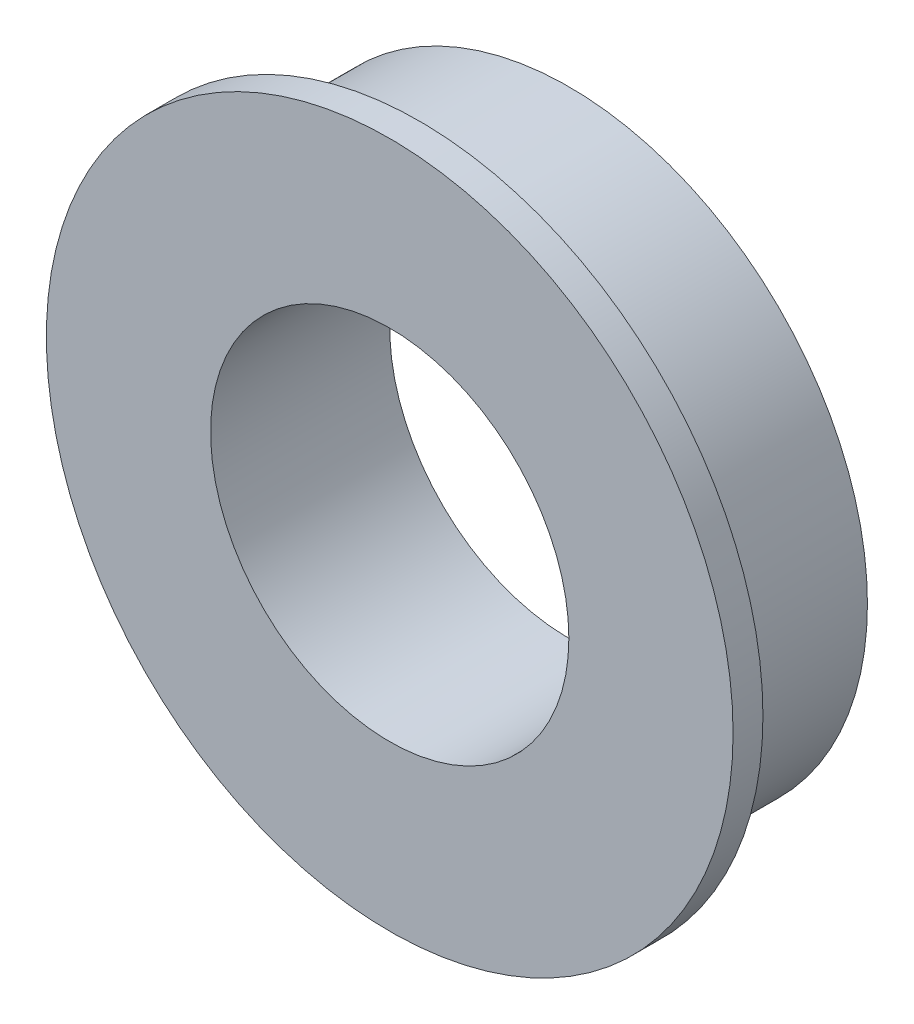
ISO-10303-21;
HEADER;
FILE_DESCRIPTION(('STEP AP214'),'2;1');
FILE_NAME('part.step','',(''),(''),'','','');
FILE_SCHEMA(('AUTOMOTIVE_DESIGN { 1 0 10303 214 1 1 1 1 }'));
ENDSEC;
DATA;
#1=APPLICATION_CONTEXT('core data for automotive mechanical design processes');
#2=APPLICATION_PROTOCOL_DEFINITION('international standard','automotive_design',2000,#1);
#3=PRODUCT_CONTEXT('',#1,'mechanical');
#4=PRODUCT('Part','Part','',(#3));
#5=PRODUCT_RELATED_PRODUCT_CATEGORY('part','',(#4));
#6=PRODUCT_DEFINITION_FORMATION('','',#4);
#7=PRODUCT_DEFINITION_CONTEXT('part definition',#1,'design');
#8=PRODUCT_DEFINITION('design','',#6,#7);
#9=PRODUCT_DEFINITION_SHAPE('','',#8);
#10=(LENGTH_UNIT() NAMED_UNIT(*) SI_UNIT(.MILLI.,.METRE.));
#11=(NAMED_UNIT(*) PLANE_ANGLE_UNIT() SI_UNIT($,.RADIAN.));
#12=(NAMED_UNIT(*) SI_UNIT($,.STERADIAN.) SOLID_ANGLE_UNIT());
#13=UNCERTAINTY_MEASURE_WITH_UNIT(LENGTH_MEASURE(1.E-05),#10,'distance_accuracy_value','');
#14=(GEOMETRIC_REPRESENTATION_CONTEXT(3) GLOBAL_UNCERTAINTY_ASSIGNED_CONTEXT((#13)) GLOBAL_UNIT_ASSIGNED_CONTEXT((#10,
#11,#12)) REPRESENTATION_CONTEXT('',''));
#15=CARTESIAN_POINT('',(0.,0.,0.));
#16=DIRECTION('',(0.,0.,1.));
#17=DIRECTION('',(1.,0.,0.));
#18=AXIS2_PLACEMENT_3D('',#15,#16,#17);
#19=CARTESIAN_POINT('',(0.,0.,0.));
#20=DIRECTION('',(0.,0.,1.));
#21=DIRECTION('',(1.,0.,0.));
#22=AXIS2_PLACEMENT_3D('',#19,#20,#21);
#23=CYLINDRICAL_SURFACE('',#22,5.75);
#24=CARTESIAN_POINT('',(0.,0.,0.5));
#25=DIRECTION('',(0.,0.,1.));
#26=DIRECTION('',(1.,0.,0.));
#27=AXIS2_PLACEMENT_3D('',#24,#25,#26);
#28=CIRCLE('',#27,5.75);
#29=CARTESIAN_POINT('',(5.75,0.,0.5));
#30=VERTEX_POINT('',#29);
#31=EDGE_CURVE('E10',#30,#30,#28,.T.);
#32=ORIENTED_EDGE('',*,*,#31,.F.);
#33=EDGE_LOOP('',(#32));
#34=FACE_BOUND('',#33,.T.);
#35=CARTESIAN_POINT('',(0.,0.,0.));
#36=DIRECTION('',(0.,0.,1.));
#37=DIRECTION('',(1.,0.,0.));
#38=AXIS2_PLACEMENT_3D('',#35,#36,#37);
#39=CIRCLE('',#38,5.75);
#40=CARTESIAN_POINT('',(5.75,0.,0.));
#41=VERTEX_POINT('',#40);
#42=EDGE_CURVE('E52',#41,#41,#39,.T.);
#43=ORIENTED_EDGE('',*,*,#42,.T.);
#44=EDGE_LOOP('',(#43));
#45=FACE_BOUND('',#44,.T.);
#46=ADVANCED_FACE('F30',(#34,#45),#23,.T.);
#47=CARTESIAN_POINT('',(0.,5.75,0.5));
#48=DIRECTION('',(0.,0.,-1.));
#49=DIRECTION('',(-1.,0.,0.));
#50=AXIS2_PLACEMENT_3D('',#47,#48,#49);
#51=PLANE('',#50);
#52=CARTESIAN_POINT('',(0.,0.,0.5));
#53=DIRECTION('',(0.,0.,1.));
#54=DIRECTION('',(1.,0.,0.));
#55=AXIS2_PLACEMENT_3D('',#52,#53,#54);
#56=CIRCLE('',#55,3.);
#57=CARTESIAN_POINT('',(3.,0.,0.5));
#58=VERTEX_POINT('',#57);
#59=EDGE_CURVE('E36',#58,#58,#56,.T.);
#60=ORIENTED_EDGE('',*,*,#59,.F.);
#61=EDGE_LOOP('',(#60));
#62=FACE_BOUND('',#61,.T.);
#63=ORIENTED_EDGE('',*,*,#31,.T.);
#64=EDGE_LOOP('',(#63));
#65=FACE_BOUND('',#64,.T.);
#66=ADVANCED_FACE('F77',(#62,#65),#51,.F.);
#67=CARTESIAN_POINT('',(0.,0.,0.));
#68=DIRECTION('',(0.,0.,1.));
#69=DIRECTION('',(1.,0.,0.));
#70=AXIS2_PLACEMENT_3D('',#67,#68,#69);
#71=CYLINDRICAL_SURFACE('',#70,3.);
#72=CARTESIAN_POINT('',(0.,0.,-2.5));
#73=DIRECTION('',(0.,0.,1.));
#74=DIRECTION('',(1.,0.,0.));
#75=AXIS2_PLACEMENT_3D('',#72,#73,#74);
#76=CIRCLE('',#75,3.);
#77=CARTESIAN_POINT('',(3.,0.,-2.5));
#78=VERTEX_POINT('',#77);
#79=EDGE_CURVE('E40',#78,#78,#76,.T.);
#80=ORIENTED_EDGE('',*,*,#79,.F.);
#81=EDGE_LOOP('',(#80));
#82=FACE_BOUND('',#81,.T.);
#83=ORIENTED_EDGE('',*,*,#59,.T.);
#84=EDGE_LOOP('',(#83));
#85=FACE_BOUND('',#84,.T.);
#86=ADVANCED_FACE('F72',(#82,#85),#71,.F.);
#87=CARTESIAN_POINT('',(0.,3.,-2.5));
#88=DIRECTION('',(0.,0.,1.));
#89=DIRECTION('',(1.,0.,0.));
#90=AXIS2_PLACEMENT_3D('',#87,#88,#89);
#91=PLANE('',#90);
#92=CARTESIAN_POINT('',(0.,0.,-2.5));
#93=DIRECTION('',(0.,0.,1.));
#94=DIRECTION('',(1.,0.,0.));
#95=AXIS2_PLACEMENT_3D('',#92,#93,#94);
#96=CIRCLE('',#95,5.);
#97=CARTESIAN_POINT('',(5.,0.,-2.5));
#98=VERTEX_POINT('',#97);
#99=EDGE_CURVE('E44',#98,#98,#96,.T.);
#100=ORIENTED_EDGE('',*,*,#99,.F.);
#101=EDGE_LOOP('',(#100));
#102=FACE_BOUND('',#101,.T.);
#103=ORIENTED_EDGE('',*,*,#79,.T.);
#104=EDGE_LOOP('',(#103));
#105=FACE_BOUND('',#104,.T.);
#106=ADVANCED_FACE('F66',(#102,#105),#91,.F.);
#107=CARTESIAN_POINT('',(0.,0.,0.));
#108=DIRECTION('',(0.,0.,1.));
#109=DIRECTION('',(1.,0.,0.));
#110=AXIS2_PLACEMENT_3D('',#107,#108,#109);
#111=CYLINDRICAL_SURFACE('',#110,5.);
#112=CARTESIAN_POINT('',(0.,0.,0.));
#113=DIRECTION('',(0.,0.,1.));
#114=DIRECTION('',(1.,0.,0.));
#115=AXIS2_PLACEMENT_3D('',#112,#113,#114);
#116=CIRCLE('',#115,5.);
#117=CARTESIAN_POINT('',(5.,0.,0.));
#118=VERTEX_POINT('',#117);
#119=EDGE_CURVE('E49',#118,#118,#116,.T.);
#120=ORIENTED_EDGE('',*,*,#119,.F.);
#121=EDGE_LOOP('',(#120));
#122=FACE_BOUND('',#121,.T.);
#123=ORIENTED_EDGE('',*,*,#99,.T.);
#124=EDGE_LOOP('',(#123));
#125=FACE_BOUND('',#124,.T.);
#126=ADVANCED_FACE('F60',(#122,#125),#111,.T.);
#127=CARTESIAN_POINT('',(0.,5.,0.));
#128=DIRECTION('',(0.,0.,1.));
#129=DIRECTION('',(1.,0.,0.));
#130=AXIS2_PLACEMENT_3D('',#127,#128,#129);
#131=PLANE('',#130);
#132=ORIENTED_EDGE('',*,*,#42,.F.);
#133=EDGE_LOOP('',(#132));
#134=FACE_BOUND('',#133,.T.);
#135=ORIENTED_EDGE('',*,*,#119,.T.);
#136=EDGE_LOOP('',(#135));
#137=FACE_BOUND('',#136,.T.);
#138=ADVANCED_FACE('F57',(#134,#137),#131,.F.);
#139=CLOSED_SHELL('',(#46,#66,#86,#106,#126,#138));
#140=MANIFOLD_SOLID_BREP('B2',#139);
#141=ADVANCED_BREP_SHAPE_REPRESENTATION('',(#18,#140),#14);
#142=SHAPE_DEFINITION_REPRESENTATION(#9,#141);
ENDSEC;
END-ISO-10303-21;
